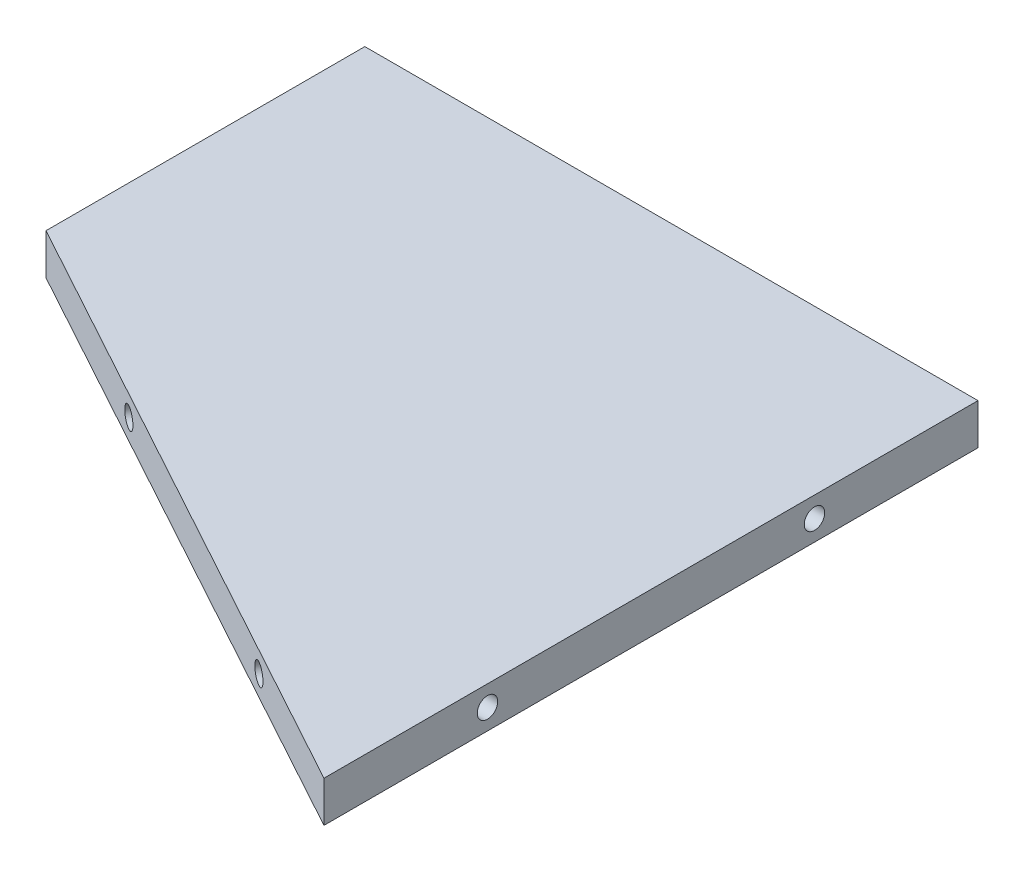
ISO-10303-21;
HEADER;
FILE_DESCRIPTION(('STEP AP214'),'2;1');
FILE_NAME('part.step','',(''),(''),'','','');
FILE_SCHEMA(('AUTOMOTIVE_DESIGN { 1 0 10303 214 1 1 1 1 }'));
ENDSEC;
DATA;
#1=APPLICATION_CONTEXT('core data for automotive mechanical design processes');
#2=APPLICATION_PROTOCOL_DEFINITION('international standard','automotive_design',2000,#1);
#3=PRODUCT_CONTEXT('',#1,'mechanical');
#4=PRODUCT('Part','Part','',(#3));
#5=PRODUCT_RELATED_PRODUCT_CATEGORY('part','',(#4));
#6=PRODUCT_DEFINITION_FORMATION('','',#4);
#7=PRODUCT_DEFINITION_CONTEXT('part definition',#1,'design');
#8=PRODUCT_DEFINITION('design','',#6,#7);
#9=PRODUCT_DEFINITION_SHAPE('','',#8);
#10=(LENGTH_UNIT() NAMED_UNIT(*) SI_UNIT(.MILLI.,.METRE.));
#11=(NAMED_UNIT(*) PLANE_ANGLE_UNIT() SI_UNIT($,.RADIAN.));
#12=(NAMED_UNIT(*) SI_UNIT($,.STERADIAN.) SOLID_ANGLE_UNIT());
#13=UNCERTAINTY_MEASURE_WITH_UNIT(LENGTH_MEASURE(1.E-05),#10,'distance_accuracy_value','');
#14=(GEOMETRIC_REPRESENTATION_CONTEXT(3) GLOBAL_UNCERTAINTY_ASSIGNED_CONTEXT((#13)) GLOBAL_UNIT_ASSIGNED_CONTEXT((#10,
#11,#12)) REPRESENTATION_CONTEXT('',''));
#15=CARTESIAN_POINT('',(0.,0.,0.));
#16=DIRECTION('',(0.,0.,1.));
#17=DIRECTION('',(1.,0.,0.));
#18=AXIS2_PLACEMENT_3D('',#15,#16,#17);
#19=CARTESIAN_POINT('',(0.,-5.,0.));
#20=DIRECTION('',(-1.,0.,0.));
#21=DIRECTION('',(0.,0.,1.));
#22=AXIS2_PLACEMENT_3D('',#19,#20,#21);
#23=PLANE('',#22);
#24=CARTESIAN_POINT('',(0.,-2.5,10.));
#25=DIRECTION('',(-1.,0.,0.));
#26=DIRECTION('',(0.,0.,1.));
#27=AXIS2_PLACEMENT_3D('',#24,#25,#26);
#28=CIRCLE('',#27,1.24999999999999);
#29=CARTESIAN_POINT('',(0.,-2.5,11.25));
#30=VERTEX_POINT('',#29);
#31=EDGE_CURVE('E158',#30,#30,#28,.T.);
#32=ORIENTED_EDGE('',*,*,#31,.F.);
#33=EDGE_LOOP('',(#32));
#34=FACE_BOUND('',#33,.T.);
#35=CARTESIAN_POINT('',(0.,-2.5,25.));
#36=DIRECTION('',(-1.,0.,0.));
#37=DIRECTION('',(0.,0.,1.));
#38=AXIS2_PLACEMENT_3D('',#35,#36,#37);
#39=CIRCLE('',#38,1.24999999999999);
#40=CARTESIAN_POINT('',(0.,-2.5,26.25));
#41=VERTEX_POINT('',#40);
#42=EDGE_CURVE('E166',#41,#41,#39,.T.);
#43=ORIENTED_EDGE('',*,*,#42,.F.);
#44=EDGE_LOOP('',(#43));
#45=FACE_BOUND('',#44,.T.);
#46=DIRECTION('',(0.,0.,1.));
#47=VECTOR('',#46,1.);
#48=CARTESIAN_POINT('',(0.,0.,0.));
#49=LINE('',#48,#47);
#50=CARTESIAN_POINT('',(0.,0.,0.));
#51=VERTEX_POINT('',#50);
#52=CARTESIAN_POINT('',(0.,0.,39.));
#53=VERTEX_POINT('',#52);
#54=EDGE_CURVE('E190',#51,#53,#49,.T.);
#55=ORIENTED_EDGE('',*,*,#54,.F.);
#56=DIRECTION('',(0.,1.,0.));
#57=VECTOR('',#56,1.);
#58=CARTESIAN_POINT('',(0.,-5.,0.));
#59=LINE('',#58,#57);
#60=CARTESIAN_POINT('',(0.,-5.,0.));
#61=VERTEX_POINT('',#60);
#62=EDGE_CURVE('E11',#61,#51,#59,.T.);
#63=ORIENTED_EDGE('',*,*,#62,.F.);
#64=DIRECTION('',(0.,0.,1.));
#65=VECTOR('',#64,1.);
#66=CARTESIAN_POINT('',(0.,-5.,0.));
#67=LINE('',#66,#65);
#68=CARTESIAN_POINT('',(0.,-5.,39.));
#69=VERTEX_POINT('',#68);
#70=EDGE_CURVE('E191',#61,#69,#67,.T.);
#71=ORIENTED_EDGE('',*,*,#70,.T.);
#72=DIRECTION('',(0.,1.,0.));
#73=VECTOR('',#72,1.);
#74=CARTESIAN_POINT('',(0.,-5.,39.));
#75=LINE('',#74,#73);
#76=EDGE_CURVE('E47',#69,#53,#75,.T.);
#77=ORIENTED_EDGE('',*,*,#76,.T.);
#78=EDGE_LOOP('',(#55,#63,#71,#77));
#79=FACE_BOUND('',#78,.T.);
#80=ADVANCED_FACE('F44',(#34,#45,#79),#23,.T.);
#81=CARTESIAN_POINT('',(0.,-5.,0.));
#82=DIRECTION('',(0.,0.,-1.));
#83=DIRECTION('',(-1.,0.,0.));
#84=AXIS2_PLACEMENT_3D('',#81,#82,#83);
#85=PLANE('',#84);
#86=CARTESIAN_POINT('',(15.,-2.5,0.));
#87=DIRECTION('',(0.,0.,-1.));
#88=DIRECTION('',(-1.,0.,0.));
#89=AXIS2_PLACEMENT_3D('',#86,#87,#88);
#90=CIRCLE('',#89,1.24999999999999);
#91=CARTESIAN_POINT('',(13.75,-2.5,0.));
#92=VERTEX_POINT('',#91);
#93=EDGE_CURVE('E174',#92,#92,#90,.T.);
#94=ORIENTED_EDGE('',*,*,#93,.F.);
#95=EDGE_LOOP('',(#94));
#96=FACE_BOUND('',#95,.T.);
#97=CARTESIAN_POINT('',(60.,-2.5,0.));
#98=DIRECTION('',(0.,0.,-1.));
#99=DIRECTION('',(-1.,0.,0.));
#100=AXIS2_PLACEMENT_3D('',#97,#98,#99);
#101=CIRCLE('',#100,1.24999999999999);
#102=CARTESIAN_POINT('',(58.75,-2.5,0.));
#103=VERTEX_POINT('',#102);
#104=EDGE_CURVE('E182',#103,#103,#101,.T.);
#105=ORIENTED_EDGE('',*,*,#104,.F.);
#106=EDGE_LOOP('',(#105));
#107=FACE_BOUND('',#106,.T.);
#108=DIRECTION('',(-1.,0.,0.));
#109=VECTOR('',#108,1.);
#110=CARTESIAN_POINT('',(0.,0.,0.));
#111=LINE('',#110,#109);
#112=CARTESIAN_POINT('',(75.,0.,0.));
#113=VERTEX_POINT('',#112);
#114=EDGE_CURVE('E195',#113,#51,#111,.T.);
#115=ORIENTED_EDGE('',*,*,#114,.F.);
#116=DIRECTION('',(0.,1.,0.));
#117=VECTOR('',#116,1.);
#118=CARTESIAN_POINT('',(75.,-5.,0.));
#119=LINE('',#118,#117);
#120=CARTESIAN_POINT('',(75.,-5.,0.));
#121=VERTEX_POINT('',#120);
#122=EDGE_CURVE('E54',#121,#113,#119,.T.);
#123=ORIENTED_EDGE('',*,*,#122,.F.);
#124=DIRECTION('',(-1.,0.,0.));
#125=VECTOR('',#124,1.);
#126=CARTESIAN_POINT('',(0.,-5.,0.));
#127=LINE('',#126,#125);
#128=EDGE_CURVE('E201',#121,#61,#127,.T.);
#129=ORIENTED_EDGE('',*,*,#128,.T.);
#130=ORIENTED_EDGE('',*,*,#62,.T.);
#131=EDGE_LOOP('',(#115,#123,#129,#130));
#132=FACE_BOUND('',#131,.T.);
#133=ADVANCED_FACE('F228',(#96,#107,#132),#85,.T.);
#134=CARTESIAN_POINT('',(75.,-5.,0.));
#135=DIRECTION('',(1.,0.,0.));
#136=DIRECTION('',(0.,0.,-1.));
#137=AXIS2_PLACEMENT_3D('',#134,#135,#136);
#138=PLANE('',#137);
#139=CARTESIAN_POINT('',(75.,-2.5,20.));
#140=DIRECTION('',(1.,0.,0.));
#141=DIRECTION('',(0.,0.,-1.));
#142=AXIS2_PLACEMENT_3D('',#139,#140,#141);
#143=CIRCLE('',#142,1.24999999999999);
#144=CARTESIAN_POINT('',(75.,-2.5,18.75));
#145=VERTEX_POINT('',#144);
#146=EDGE_CURVE('E142',#145,#145,#143,.T.);
#147=ORIENTED_EDGE('',*,*,#146,.F.);
#148=EDGE_LOOP('',(#147));
#149=FACE_BOUND('',#148,.T.);
#150=CARTESIAN_POINT('',(75.,-2.5,60.));
#151=DIRECTION('',(1.,0.,0.));
#152=DIRECTION('',(0.,0.,-1.));
#153=AXIS2_PLACEMENT_3D('',#150,#151,#152);
#154=CIRCLE('',#153,1.24999999999999);
#155=CARTESIAN_POINT('',(75.,-2.5,58.75));
#156=VERTEX_POINT('',#155);
#157=EDGE_CURVE('E150',#156,#156,#154,.T.);
#158=ORIENTED_EDGE('',*,*,#157,.F.);
#159=EDGE_LOOP('',(#158));
#160=FACE_BOUND('',#159,.T.);
#161=DIRECTION('',(0.,0.,-1.));
#162=VECTOR('',#161,1.);
#163=CARTESIAN_POINT('',(75.,0.,0.));
#164=LINE('',#163,#162);
#165=CARTESIAN_POINT('',(75.,0.,80.));
#166=VERTEX_POINT('',#165);
#167=EDGE_CURVE('E211',#166,#113,#164,.T.);
#168=ORIENTED_EDGE('',*,*,#167,.F.);
#169=DIRECTION('',(0.,1.,0.));
#170=VECTOR('',#169,1.);
#171=CARTESIAN_POINT('',(75.,-5.,80.));
#172=LINE('',#171,#170);
#173=CARTESIAN_POINT('',(75.,-5.,80.));
#174=VERTEX_POINT('',#173);
#175=EDGE_CURVE('E218',#174,#166,#172,.T.);
#176=ORIENTED_EDGE('',*,*,#175,.F.);
#177=DIRECTION('',(0.,0.,-1.));
#178=VECTOR('',#177,1.);
#179=CARTESIAN_POINT('',(75.,-5.,0.));
#180=LINE('',#179,#178);
#181=EDGE_CURVE('E198',#174,#121,#180,.T.);
#182=ORIENTED_EDGE('',*,*,#181,.T.);
#183=ORIENTED_EDGE('',*,*,#122,.T.);
#184=EDGE_LOOP('',(#168,#176,#182,#183));
#185=FACE_BOUND('',#184,.T.);
#186=ADVANCED_FACE('F231',(#149,#160,#185),#138,.T.);
#187=CARTESIAN_POINT('',(0.,-5.,39.));
#188=DIRECTION('',(-0.47967161866996,0.,0.877448082932854));
#189=DIRECTION('',(0.877448082932854,0.,0.47967161866996));
#190=AXIS2_PLACEMENT_3D('',#187,#188,#189);
#191=PLANE('',#190);
#192=CARTESIAN_POINT('',(22.3531150240288,-2.5,51.2197028798024));
#193=DIRECTION('',(-0.47967161866996,0.,0.877448082932854));
#194=DIRECTION('',(0.877448082932854,0.,0.47967161866996));
#195=AXIS2_PLACEMENT_3D('',#192,#193,#194);
#196=CIRCLE('',#195,1.24999999999999);
#197=CARTESIAN_POINT('',(23.4499251276948,-2.5,51.8192924031399));
#198=VERTEX_POINT('',#197);
#199=EDGE_CURVE('E127',#198,#198,#196,.T.);
#200=ORIENTED_EDGE('',*,*,#199,.F.);
#201=EDGE_LOOP('',(#200));
#202=FACE_BOUND('',#201,.T.);
#203=CARTESIAN_POINT('',(57.4510383413429,-2.5,70.4065676266008));
#204=DIRECTION('',(-0.47967161866996,0.,0.877448082932854));
#205=DIRECTION('',(0.877448082932854,0.,0.47967161866996));
#206=AXIS2_PLACEMENT_3D('',#203,#204,#205);
#207=CIRCLE('',#206,1.24999999999999);
#208=CARTESIAN_POINT('',(58.547848445009,-2.5,71.0061571499383));
#209=VERTEX_POINT('',#208);
#210=EDGE_CURVE('E126',#209,#209,#207,.T.);
#211=ORIENTED_EDGE('',*,*,#210,.F.);
#212=EDGE_LOOP('',(#211));
#213=FACE_BOUND('',#212,.T.);
#214=DIRECTION('',(0.877448082932854,0.,0.47967161866996));
#215=VECTOR('',#214,1.);
#216=CARTESIAN_POINT('',(0.,0.,39.));
#217=LINE('',#216,#215);
#218=EDGE_CURVE('E207',#53,#166,#217,.T.);
#219=ORIENTED_EDGE('',*,*,#218,.F.);
#220=ORIENTED_EDGE('',*,*,#76,.F.);
#221=DIRECTION('',(0.877448082932854,0.,0.47967161866996));
#222=VECTOR('',#221,1.);
#223=CARTESIAN_POINT('',(0.,-5.,39.));
#224=LINE('',#223,#222);
#225=EDGE_CURVE('E194',#69,#174,#224,.T.);
#226=ORIENTED_EDGE('',*,*,#225,.T.);
#227=ORIENTED_EDGE('',*,*,#175,.T.);
#228=EDGE_LOOP('',(#219,#220,#226,#227));
#229=FACE_BOUND('',#228,.T.);
#230=ADVANCED_FACE('F225',(#202,#213,#229),#191,.T.);
#231=CARTESIAN_POINT('',(0.,-5.,0.));
#232=DIRECTION('',(0.,1.,0.));
#233=DIRECTION('',(0.,0.,1.));
#234=AXIS2_PLACEMENT_3D('',#231,#232,#233);
#235=PLANE('',#234);
#236=ORIENTED_EDGE('',*,*,#70,.F.);
#237=ORIENTED_EDGE('',*,*,#128,.F.);
#238=ORIENTED_EDGE('',*,*,#181,.F.);
#239=ORIENTED_EDGE('',*,*,#225,.F.);
#240=EDGE_LOOP('',(#236,#237,#238,#239));
#241=FACE_BOUND('',#240,.T.);
#242=ADVANCED_FACE('F233',(#241),#235,.F.);
#243=CARTESIAN_POINT('',(0.,0.,0.));
#244=DIRECTION('',(0.,1.,0.));
#245=DIRECTION('',(0.,0.,1.));
#246=AXIS2_PLACEMENT_3D('',#243,#244,#245);
#247=PLANE('',#246);
#248=ORIENTED_EDGE('',*,*,#54,.T.);
#249=ORIENTED_EDGE('',*,*,#218,.T.);
#250=ORIENTED_EDGE('',*,*,#167,.T.);
#251=ORIENTED_EDGE('',*,*,#114,.T.);
#252=EDGE_LOOP('',(#248,#249,#250,#251));
#253=FACE_BOUND('',#252,.T.);
#254=ADVANCED_FACE('F227',(#253),#247,.T.);
#255=CARTESIAN_POINT('',(60.,-2.5,7.50000000000001));
#256=DIRECTION('',(0.,0.,-1.));
#257=DIRECTION('',(-1.,0.,0.));
#258=AXIS2_PLACEMENT_3D('',#255,#256,#257);
#259=CONICAL_SURFACE('',#258,1.24999999999999,1.02974425867665);
#260=CARTESIAN_POINT('',(60.,-2.5,8.25107577378445));
#261=VERTEX_POINT('',#260);
#262=VERTEX_LOOP('',#261);
#263=FACE_BOUND('',#262,.T.);
#264=CARTESIAN_POINT('',(60.,-2.5,7.50000000000001));
#265=DIRECTION('',(0.,0.,-1.));
#266=DIRECTION('',(-1.,0.,0.));
#267=AXIS2_PLACEMENT_3D('',#264,#265,#266);
#268=CIRCLE('',#267,1.24999999999999);
#269=CARTESIAN_POINT('',(58.75,-2.5,7.50000000000001));
#270=VERTEX_POINT('',#269);
#271=EDGE_CURVE('E186',#270,#270,#268,.T.);
#272=ORIENTED_EDGE('',*,*,#271,.T.);
#273=EDGE_LOOP('',(#272));
#274=FACE_BOUND('',#273,.T.);
#275=ADVANCED_FACE('F240',(#263,#274),#259,.F.);
#276=CARTESIAN_POINT('',(60.,-2.5,0.));
#277=DIRECTION('',(0.,0.,-1.));
#278=DIRECTION('',(-1.,0.,0.));
#279=AXIS2_PLACEMENT_3D('',#276,#277,#278);
#280=CYLINDRICAL_SURFACE('',#279,1.24999999999999);
#281=ORIENTED_EDGE('',*,*,#271,.F.);
#282=EDGE_LOOP('',(#281));
#283=FACE_BOUND('',#282,.T.);
#284=ORIENTED_EDGE('',*,*,#104,.T.);
#285=EDGE_LOOP('',(#284));
#286=FACE_BOUND('',#285,.T.);
#287=ADVANCED_FACE('F280',(#283,#286),#280,.F.);
#288=CARTESIAN_POINT('',(15.,-2.5,7.50000000000001));
#289=DIRECTION('',(0.,0.,-1.));
#290=DIRECTION('',(-1.,0.,0.));
#291=AXIS2_PLACEMENT_3D('',#288,#289,#290);
#292=CONICAL_SURFACE('',#291,1.24999999999999,1.02974425867665);
#293=CARTESIAN_POINT('',(15.,-2.5,8.25107577378445));
#294=VERTEX_POINT('',#293);
#295=VERTEX_LOOP('',#294);
#296=FACE_BOUND('',#295,.T.);
#297=CARTESIAN_POINT('',(15.,-2.5,7.50000000000001));
#298=DIRECTION('',(0.,0.,-1.));
#299=DIRECTION('',(-1.,0.,0.));
#300=AXIS2_PLACEMENT_3D('',#297,#298,#299);
#301=CIRCLE('',#300,1.24999999999999);
#302=CARTESIAN_POINT('',(13.75,-2.5,7.50000000000001));
#303=VERTEX_POINT('',#302);
#304=EDGE_CURVE('E178',#303,#303,#301,.T.);
#305=ORIENTED_EDGE('',*,*,#304,.T.);
#306=EDGE_LOOP('',(#305));
#307=FACE_BOUND('',#306,.T.);
#308=ADVANCED_FACE('F276',(#296,#307),#292,.F.);
#309=CARTESIAN_POINT('',(15.,-2.5,0.));
#310=DIRECTION('',(0.,0.,-1.));
#311=DIRECTION('',(-1.,0.,0.));
#312=AXIS2_PLACEMENT_3D('',#309,#310,#311);
#313=CYLINDRICAL_SURFACE('',#312,1.24999999999999);
#314=ORIENTED_EDGE('',*,*,#304,.F.);
#315=EDGE_LOOP('',(#314));
#316=FACE_BOUND('',#315,.T.);
#317=ORIENTED_EDGE('',*,*,#93,.T.);
#318=EDGE_LOOP('',(#317));
#319=FACE_BOUND('',#318,.T.);
#320=ADVANCED_FACE('F268',(#316,#319),#313,.F.);
#321=CARTESIAN_POINT('',(7.49999999999999,-2.5,25.));
#322=DIRECTION('',(-1.,0.,0.));
#323=DIRECTION('',(0.,0.,1.));
#324=AXIS2_PLACEMENT_3D('',#321,#322,#323);
#325=CONICAL_SURFACE('',#324,1.24999999999999,1.02974425867664);
#326=CARTESIAN_POINT('',(8.25107577378445,-2.5,25.));
#327=VERTEX_POINT('',#326);
#328=VERTEX_LOOP('',#327);
#329=FACE_BOUND('',#328,.T.);
#330=CARTESIAN_POINT('',(7.49999999999999,-2.5,25.));
#331=DIRECTION('',(-1.,0.,0.));
#332=DIRECTION('',(0.,0.,1.));
#333=AXIS2_PLACEMENT_3D('',#330,#331,#332);
#334=CIRCLE('',#333,1.24999999999999);
#335=CARTESIAN_POINT('',(7.49999999999999,-2.5,26.25));
#336=VERTEX_POINT('',#335);
#337=EDGE_CURVE('E170',#336,#336,#334,.T.);
#338=ORIENTED_EDGE('',*,*,#337,.T.);
#339=EDGE_LOOP('',(#338));
#340=FACE_BOUND('',#339,.T.);
#341=ADVANCED_FACE('F258',(#329,#340),#325,.F.);
#342=CARTESIAN_POINT('',(0.,-2.5,25.));
#343=DIRECTION('',(-1.,0.,0.));
#344=DIRECTION('',(0.,0.,1.));
#345=AXIS2_PLACEMENT_3D('',#342,#343,#344);
#346=CYLINDRICAL_SURFACE('',#345,1.24999999999999);
#347=ORIENTED_EDGE('',*,*,#337,.F.);
#348=EDGE_LOOP('',(#347));
#349=FACE_BOUND('',#348,.T.);
#350=ORIENTED_EDGE('',*,*,#42,.T.);
#351=EDGE_LOOP('',(#350));
#352=FACE_BOUND('',#351,.T.);
#353=ADVANCED_FACE('F255',(#349,#352),#346,.F.);
#354=CARTESIAN_POINT('',(7.49999999999999,-2.5,10.));
#355=DIRECTION('',(-1.,0.,0.));
#356=DIRECTION('',(0.,0.,1.));
#357=AXIS2_PLACEMENT_3D('',#354,#355,#356);
#358=CONICAL_SURFACE('',#357,1.24999999999999,1.02974425867664);
#359=CARTESIAN_POINT('',(8.25107577378445,-2.5,10.));
#360=VERTEX_POINT('',#359);
#361=VERTEX_LOOP('',#360);
#362=FACE_BOUND('',#361,.T.);
#363=CARTESIAN_POINT('',(7.49999999999999,-2.5,10.));
#364=DIRECTION('',(-1.,0.,0.));
#365=DIRECTION('',(0.,0.,1.));
#366=AXIS2_PLACEMENT_3D('',#363,#364,#365);
#367=CIRCLE('',#366,1.24999999999999);
#368=CARTESIAN_POINT('',(7.49999999999999,-2.5,11.25));
#369=VERTEX_POINT('',#368);
#370=EDGE_CURVE('E162',#369,#369,#367,.T.);
#371=ORIENTED_EDGE('',*,*,#370,.T.);
#372=EDGE_LOOP('',(#371));
#373=FACE_BOUND('',#372,.T.);
#374=ADVANCED_FACE('F257',(#362,#373),#358,.F.);
#375=CARTESIAN_POINT('',(0.,-2.5,10.));
#376=DIRECTION('',(-1.,0.,0.));
#377=DIRECTION('',(0.,0.,1.));
#378=AXIS2_PLACEMENT_3D('',#375,#376,#377);
#379=CYLINDRICAL_SURFACE('',#378,1.24999999999999);
#380=ORIENTED_EDGE('',*,*,#370,.F.);
#381=EDGE_LOOP('',(#380));
#382=FACE_BOUND('',#381,.T.);
#383=ORIENTED_EDGE('',*,*,#31,.T.);
#384=EDGE_LOOP('',(#383));
#385=FACE_BOUND('',#384,.T.);
#386=ADVANCED_FACE('F265',(#382,#385),#379,.F.);
#387=CARTESIAN_POINT('',(67.5,-2.5,60.));
#388=DIRECTION('',(1.,0.,0.));
#389=DIRECTION('',(0.,0.,-1.));
#390=AXIS2_PLACEMENT_3D('',#387,#388,#389);
#391=CONICAL_SURFACE('',#390,1.24999999999999,1.02974425867665);
#392=CARTESIAN_POINT('',(66.7489242262156,-2.5,60.));
#393=VERTEX_POINT('',#392);
#394=VERTEX_LOOP('',#393);
#395=FACE_BOUND('',#394,.T.);
#396=CARTESIAN_POINT('',(67.5,-2.5,60.));
#397=DIRECTION('',(1.,0.,0.));
#398=DIRECTION('',(0.,0.,-1.));
#399=AXIS2_PLACEMENT_3D('',#396,#397,#398);
#400=CIRCLE('',#399,1.24999999999999);
#401=CARTESIAN_POINT('',(67.5,-2.5,58.75));
#402=VERTEX_POINT('',#401);
#403=EDGE_CURVE('E154',#402,#402,#400,.T.);
#404=ORIENTED_EDGE('',*,*,#403,.T.);
#405=EDGE_LOOP('',(#404));
#406=FACE_BOUND('',#405,.T.);
#407=ADVANCED_FACE('F327',(#395,#406),#391,.F.);
#408=CARTESIAN_POINT('',(75.,-2.5,60.));
#409=DIRECTION('',(1.,0.,0.));
#410=DIRECTION('',(0.,0.,-1.));
#411=AXIS2_PLACEMENT_3D('',#408,#409,#410);
#412=CYLINDRICAL_SURFACE('',#411,1.24999999999999);
#413=ORIENTED_EDGE('',*,*,#403,.F.);
#414=EDGE_LOOP('',(#413));
#415=FACE_BOUND('',#414,.T.);
#416=ORIENTED_EDGE('',*,*,#157,.T.);
#417=EDGE_LOOP('',(#416));
#418=FACE_BOUND('',#417,.T.);
#419=ADVANCED_FACE('F335',(#415,#418),#412,.F.);
#420=CARTESIAN_POINT('',(67.5,-2.5,20.));
#421=DIRECTION('',(1.,0.,0.));
#422=DIRECTION('',(0.,0.,-1.));
#423=AXIS2_PLACEMENT_3D('',#420,#421,#422);
#424=CONICAL_SURFACE('',#423,1.24999999999999,1.02974425867665);
#425=CARTESIAN_POINT('',(66.7489242262155,-2.5,20.));
#426=VERTEX_POINT('',#425);
#427=VERTEX_LOOP('',#426);
#428=FACE_BOUND('',#427,.T.);
#429=CARTESIAN_POINT('',(67.5,-2.5,20.));
#430=DIRECTION('',(1.,0.,0.));
#431=DIRECTION('',(0.,0.,-1.));
#432=AXIS2_PLACEMENT_3D('',#429,#430,#431);
#433=CIRCLE('',#432,1.24999999999999);
#434=CARTESIAN_POINT('',(67.5,-2.5,18.75));
#435=VERTEX_POINT('',#434);
#436=EDGE_CURVE('E146',#435,#435,#433,.T.);
#437=ORIENTED_EDGE('',*,*,#436,.T.);
#438=EDGE_LOOP('',(#437));
#439=FACE_BOUND('',#438,.T.);
#440=ADVANCED_FACE('F344',(#428,#439),#424,.F.);
#441=CARTESIAN_POINT('',(75.,-2.5,20.));
#442=DIRECTION('',(1.,0.,0.));
#443=DIRECTION('',(0.,0.,-1.));
#444=AXIS2_PLACEMENT_3D('',#441,#442,#443);
#445=CYLINDRICAL_SURFACE('',#444,1.24999999999999);
#446=ORIENTED_EDGE('',*,*,#436,.F.);
#447=EDGE_LOOP('',(#446));
#448=FACE_BOUND('',#447,.T.);
#449=ORIENTED_EDGE('',*,*,#146,.T.);
#450=EDGE_LOOP('',(#449));
#451=FACE_BOUND('',#450,.T.);
#452=ADVANCED_FACE('F353',(#448,#451),#445,.F.);
#453=CARTESIAN_POINT('',(61.0485754813676,-2.5,63.8257070046044));
#454=DIRECTION('',(-0.47967161866996,0.,0.877448082932854));
#455=DIRECTION('',(0.877448082932854,0.,0.47967161866996));
#456=AXIS2_PLACEMENT_3D('',#453,#454,#455);
#457=CONICAL_SURFACE('',#456,1.24999999999999,1.02974425867664);
#458=CARTESIAN_POINT('',(61.4088452135226,-2.5,63.1666770067599));
#459=VERTEX_POINT('',#458);
#460=VERTEX_LOOP('',#459);
#461=FACE_BOUND('',#460,.T.);
#462=CARTESIAN_POINT('',(61.0485754813676,-2.5,63.8257070046044));
#463=DIRECTION('',(-0.47967161866996,0.,0.877448082932854));
#464=DIRECTION('',(0.877448082932854,0.,0.47967161866996));
#465=AXIS2_PLACEMENT_3D('',#462,#463,#464);
#466=CIRCLE('',#465,1.24999999999999);
#467=CARTESIAN_POINT('',(62.1453855850337,-2.5,64.4252965279419));
#468=VERTEX_POINT('',#467);
#469=EDGE_CURVE('E134',#468,#468,#466,.T.);
#470=ORIENTED_EDGE('',*,*,#469,.T.);
#471=EDGE_LOOP('',(#470));
#472=FACE_BOUND('',#471,.T.);
#473=ADVANCED_FACE('F362',(#461,#472),#457,.F.);
#474=CARTESIAN_POINT('',(57.4510383413429,-2.5,70.4065676266008));
#475=DIRECTION('',(-0.47967161866996,0.,0.877448082932854));
#476=DIRECTION('',(0.877448082932854,0.,0.47967161866996));
#477=AXIS2_PLACEMENT_3D('',#474,#475,#476);
#478=CYLINDRICAL_SURFACE('',#477,1.24999999999999);
#479=ORIENTED_EDGE('',*,*,#469,.F.);
#480=EDGE_LOOP('',(#479));
#481=FACE_BOUND('',#480,.T.);
#482=ORIENTED_EDGE('',*,*,#210,.T.);
#483=EDGE_LOOP('',(#482));
#484=FACE_BOUND('',#483,.T.);
#485=ADVANCED_FACE('F119',(#481,#484),#478,.F.);
#486=CARTESIAN_POINT('',(25.9506521640535,-2.5,44.638842257806));
#487=DIRECTION('',(-0.47967161866996,0.,0.877448082932854));
#488=DIRECTION('',(0.877448082932854,0.,0.47967161866996));
#489=AXIS2_PLACEMENT_3D('',#486,#487,#488);
#490=CONICAL_SURFACE('',#489,1.24999999999999,1.02974425867665);
#491=CARTESIAN_POINT('',(26.3109218962085,-2.5,43.9798122599615));
#492=VERTEX_POINT('',#491);
#493=VERTEX_LOOP('',#492);
#494=FACE_BOUND('',#493,.T.);
#495=CARTESIAN_POINT('',(25.9506521640535,-2.5,44.638842257806));
#496=DIRECTION('',(-0.47967161866996,0.,0.877448082932854));
#497=DIRECTION('',(0.877448082932854,0.,0.47967161866996));
#498=AXIS2_PLACEMENT_3D('',#495,#496,#497);
#499=CIRCLE('',#498,1.24999999999999);
#500=CARTESIAN_POINT('',(27.0474622677195,-2.5,45.2384317811435));
#501=VERTEX_POINT('',#500);
#502=EDGE_CURVE('E123',#501,#501,#499,.T.);
#503=ORIENTED_EDGE('',*,*,#502,.T.);
#504=EDGE_LOOP('',(#503));
#505=FACE_BOUND('',#504,.T.);
#506=ADVANCED_FACE('F115',(#494,#505),#490,.F.);
#507=CARTESIAN_POINT('',(22.3531150240288,-2.5,51.2197028798024));
#508=DIRECTION('',(-0.47967161866996,0.,0.877448082932854));
#509=DIRECTION('',(0.877448082932854,0.,0.47967161866996));
#510=AXIS2_PLACEMENT_3D('',#507,#508,#509);
#511=CYLINDRICAL_SURFACE('',#510,1.24999999999999);
#512=ORIENTED_EDGE('',*,*,#502,.F.);
#513=EDGE_LOOP('',(#512));
#514=FACE_BOUND('',#513,.T.);
#515=ORIENTED_EDGE('',*,*,#199,.T.);
#516=EDGE_LOOP('',(#515));
#517=FACE_BOUND('',#516,.T.);
#518=ADVANCED_FACE('F118',(#514,#517),#511,.F.);
#519=CLOSED_SHELL('',(#80,#133,#186,#230,#242,#254,#275,#287,#308,#320,#341,#353,#374,#386,#407,
#419,#440,#452,#473,#485,#506,#518));
#520=MANIFOLD_SOLID_BREP('B2',#519);
#521=ADVANCED_BREP_SHAPE_REPRESENTATION('',(#18,#520),#14);
#522=SHAPE_DEFINITION_REPRESENTATION(#9,#521);
ENDSEC;
END-ISO-10303-21;
